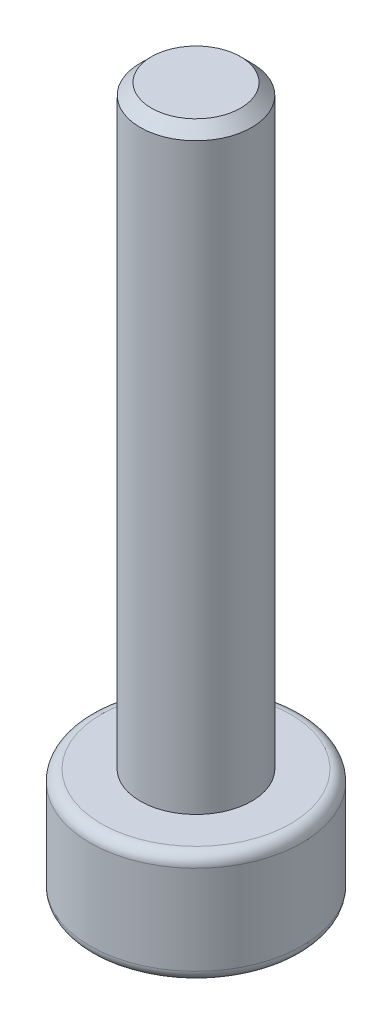
ISO-10303-21;
HEADER;
FILE_DESCRIPTION(('STEP AP214'),'2;1');
FILE_NAME('part.step','',(''),(''),'','','');
FILE_SCHEMA(('AUTOMOTIVE_DESIGN { 1 0 10303 214 1 1 1 1 }'));
ENDSEC;
DATA;
#1=APPLICATION_CONTEXT('core data for automotive mechanical design processes');
#2=APPLICATION_PROTOCOL_DEFINITION('international standard','automotive_design',2000,#1);
#3=PRODUCT_CONTEXT('',#1,'mechanical');
#4=PRODUCT('Part','Part','',(#3));
#5=PRODUCT_RELATED_PRODUCT_CATEGORY('part','',(#4));
#6=PRODUCT_DEFINITION_FORMATION('','',#4);
#7=PRODUCT_DEFINITION_CONTEXT('part definition',#1,'design');
#8=PRODUCT_DEFINITION('design','',#6,#7);
#9=PRODUCT_DEFINITION_SHAPE('','',#8);
#10=(LENGTH_UNIT() NAMED_UNIT(*) SI_UNIT(.MILLI.,.METRE.));
#11=(NAMED_UNIT(*) PLANE_ANGLE_UNIT() SI_UNIT($,.RADIAN.));
#12=(NAMED_UNIT(*) SI_UNIT($,.STERADIAN.) SOLID_ANGLE_UNIT());
#13=UNCERTAINTY_MEASURE_WITH_UNIT(LENGTH_MEASURE(1.E-05),#10,'distance_accuracy_value','');
#14=(GEOMETRIC_REPRESENTATION_CONTEXT(3) GLOBAL_UNCERTAINTY_ASSIGNED_CONTEXT((#13)) GLOBAL_UNIT_ASSIGNED_CONTEXT((#10,
#11,#12)) REPRESENTATION_CONTEXT('',''));
#15=CARTESIAN_POINT('',(0.,0.,0.));
#16=DIRECTION('',(0.,0.,1.));
#17=DIRECTION('',(1.,0.,0.));
#18=AXIS2_PLACEMENT_3D('',#15,#16,#17);
#19=CARTESIAN_POINT('',(0.,3.,0.));
#20=DIRECTION('',(0.,-1.,0.));
#21=DIRECTION('',(0.,0.,-1.));
#22=AXIS2_PLACEMENT_3D('',#19,#20,#21);
#23=CYLINDRICAL_SURFACE('',#22,2.85);
#24=CARTESIAN_POINT('',(0.,2.7,0.));
#25=DIRECTION('',(0.,1.,0.));
#26=DIRECTION('',(0.,0.,1.));
#27=AXIS2_PLACEMENT_3D('',#24,#25,#26);
#28=CIRCLE('',#27,2.85);
#29=CARTESIAN_POINT('',(0.,2.7,2.85));
#30=VERTEX_POINT('',#29);
#31=EDGE_CURVE('E68',#30,#30,#28,.F.);
#32=ORIENTED_EDGE('',*,*,#31,.T.);
#33=EDGE_LOOP('',(#32));
#34=FACE_BOUND('',#33,.T.);
#35=CARTESIAN_POINT('',(0.,0.3,0.));
#36=DIRECTION('',(0.,1.,0.));
#37=DIRECTION('',(0.,0.,1.));
#38=AXIS2_PLACEMENT_3D('',#35,#36,#37);
#39=CIRCLE('',#38,2.85);
#40=CARTESIAN_POINT('',(0.,0.3,2.85));
#41=VERTEX_POINT('',#40);
#42=EDGE_CURVE('E72',#41,#41,#39,.T.);
#43=ORIENTED_EDGE('',*,*,#42,.T.);
#44=EDGE_LOOP('',(#43));
#45=FACE_BOUND('',#44,.T.);
#46=ADVANCED_FACE('F39',(#34,#45),#23,.T.);
#47=CARTESIAN_POINT('',(0.,3.,0.));
#48=DIRECTION('',(0.,1.,0.));
#49=DIRECTION('',(0.,0.,1.));
#50=AXIS2_PLACEMENT_3D('',#47,#48,#49);
#51=PLANE('',#50);
#52=CARTESIAN_POINT('',(0.,3.,0.));
#53=DIRECTION('',(0.,1.,0.));
#54=DIRECTION('',(0.,0.,1.));
#55=AXIS2_PLACEMENT_3D('',#52,#53,#54);
#56=CIRCLE('',#55,2.55);
#57=CARTESIAN_POINT('',(0.,3.,2.55));
#58=VERTEX_POINT('',#57);
#59=EDGE_CURVE('E76',#58,#58,#56,.T.);
#60=ORIENTED_EDGE('',*,*,#59,.T.);
#61=EDGE_LOOP('',(#60));
#62=FACE_BOUND('',#61,.T.);
#63=CARTESIAN_POINT('',(0.,3.,0.));
#64=DIRECTION('',(0.,1.,0.));
#65=DIRECTION('',(0.,0.,1.));
#66=AXIS2_PLACEMENT_3D('',#63,#64,#65);
#67=CIRCLE('',#66,1.5);
#68=CARTESIAN_POINT('',(0.,3.,1.5));
#69=VERTEX_POINT('',#68);
#70=EDGE_CURVE('E80',#69,#69,#67,.T.);
#71=ORIENTED_EDGE('',*,*,#70,.F.);
#72=EDGE_LOOP('',(#71));
#73=FACE_BOUND('',#72,.T.);
#74=ADVANCED_FACE('F105',(#62,#73),#51,.T.);
#75=CARTESIAN_POINT('',(0.,0.,0.));
#76=DIRECTION('',(0.,1.,0.));
#77=DIRECTION('',(0.,0.,1.));
#78=AXIS2_PLACEMENT_3D('',#75,#76,#77);
#79=PLANE('',#78);
#80=CARTESIAN_POINT('',(0.,0.,0.));
#81=DIRECTION('',(0.,1.,0.));
#82=DIRECTION('',(0.,0.,1.));
#83=AXIS2_PLACEMENT_3D('',#80,#81,#82);
#84=CIRCLE('',#83,1.44);
#85=CARTESIAN_POINT('',(0.,0.,1.44));
#86=VERTEX_POINT('',#85);
#87=EDGE_CURVE('E10',#86,#86,#84,.T.);
#88=ORIENTED_EDGE('',*,*,#87,.T.);
#89=EDGE_LOOP('',(#88));
#90=FACE_BOUND('',#89,.T.);
#91=CARTESIAN_POINT('',(0.,0.,0.));
#92=DIRECTION('',(0.,1.,0.));
#93=DIRECTION('',(0.,0.,1.));
#94=AXIS2_PLACEMENT_3D('',#91,#92,#93);
#95=CIRCLE('',#94,2.55);
#96=CARTESIAN_POINT('',(0.,0.,2.55));
#97=VERTEX_POINT('',#96);
#98=EDGE_CURVE('E64',#97,#97,#95,.F.);
#99=ORIENTED_EDGE('',*,*,#98,.T.);
#100=EDGE_LOOP('',(#99));
#101=FACE_BOUND('',#100,.T.);
#102=ADVANCED_FACE('F111',(#90,#101),#79,.F.);
#103=CARTESIAN_POINT('',(0.,19.,0.));
#104=DIRECTION('',(0.,-1.,0.));
#105=DIRECTION('',(0.,0.,-1.));
#106=AXIS2_PLACEMENT_3D('',#103,#104,#105);
#107=CYLINDRICAL_SURFACE('',#106,1.5);
#108=CARTESIAN_POINT('',(0.,18.7,0.));
#109=DIRECTION('',(0.,1.,0.));
#110=DIRECTION('',(0.,0.,1.));
#111=AXIS2_PLACEMENT_3D('',#108,#109,#110);
#112=CIRCLE('',#111,1.5);
#113=CARTESIAN_POINT('',(0.,18.7,1.5));
#114=VERTEX_POINT('',#113);
#115=EDGE_CURVE('E53',#114,#114,#112,.F.);
#116=ORIENTED_EDGE('',*,*,#115,.T.);
#117=EDGE_LOOP('',(#116));
#118=FACE_BOUND('',#117,.T.);
#119=ORIENTED_EDGE('',*,*,#70,.T.);
#120=EDGE_LOOP('',(#119));
#121=FACE_BOUND('',#120,.T.);
#122=ADVANCED_FACE('F101',(#118,#121),#107,.T.);
#123=CARTESIAN_POINT('',(0.,19.,0.));
#124=DIRECTION('',(0.,1.,0.));
#125=DIRECTION('',(0.,0.,1.));
#126=AXIS2_PLACEMENT_3D('',#123,#124,#125);
#127=PLANE('',#126);
#128=CARTESIAN_POINT('',(0.,19.,0.));
#129=DIRECTION('',(0.,1.,0.));
#130=DIRECTION('',(0.,0.,1.));
#131=AXIS2_PLACEMENT_3D('',#128,#129,#130);
#132=CIRCLE('',#131,1.2);
#133=CARTESIAN_POINT('',(0.,19.,1.2));
#134=VERTEX_POINT('',#133);
#135=EDGE_CURVE('E58',#134,#134,#132,.T.);
#136=ORIENTED_EDGE('',*,*,#135,.T.);
#137=EDGE_LOOP('',(#136));
#138=FACE_BOUND('',#137,.T.);
#139=ADVANCED_FACE('F93',(#138),#127,.T.);
#140=CARTESIAN_POINT('',(0.,1.3,0.));
#141=DIRECTION('',(0.,-1.,0.));
#142=DIRECTION('',(0.,0.,-1.));
#143=AXIS2_PLACEMENT_3D('',#140,#141,#142);
#144=CYLINDRICAL_SURFACE('',#143,1.29);
#145=CARTESIAN_POINT('',(0.,0.15,0.));
#146=DIRECTION('',(0.,1.,0.));
#147=DIRECTION('',(0.,0.,1.));
#148=AXIS2_PLACEMENT_3D('',#145,#146,#147);
#149=CIRCLE('',#148,1.29);
#150=CARTESIAN_POINT('',(0.,0.15,1.29));
#151=VERTEX_POINT('',#150);
#152=EDGE_CURVE('E48',#151,#151,#149,.F.);
#153=ORIENTED_EDGE('',*,*,#152,.T.);
#154=EDGE_LOOP('',(#153));
#155=FACE_BOUND('',#154,.T.);
#156=CARTESIAN_POINT('',(0.,1.3,0.));
#157=DIRECTION('',(0.,-1.,0.));
#158=DIRECTION('',(0.,0.,-1.));
#159=AXIS2_PLACEMENT_3D('',#156,#157,#158);
#160=CIRCLE('',#159,1.29);
#161=CARTESIAN_POINT('',(0.,1.3,-1.29));
#162=VERTEX_POINT('',#161);
#163=EDGE_CURVE('E84',#162,#162,#160,.T.);
#164=ORIENTED_EDGE('',*,*,#163,.F.);
#165=EDGE_LOOP('',(#164));
#166=FACE_BOUND('',#165,.T.);
#167=ADVANCED_FACE('F91',(#155,#166),#144,.F.);
#168=CARTESIAN_POINT('',(0.,1.3,0.));
#169=DIRECTION('',(0.,-1.,0.));
#170=DIRECTION('',(0.,0.,-1.));
#171=AXIS2_PLACEMENT_3D('',#168,#169,#170);
#172=PLANE('',#171);
#173=ORIENTED_EDGE('',*,*,#163,.T.);
#174=EDGE_LOOP('',(#173));
#175=FACE_BOUND('',#174,.T.);
#176=ADVANCED_FACE('F89',(#175),#172,.T.);
#177=CARTESIAN_POINT('',(0.,2.7,0.));
#178=DIRECTION('',(0.,1.,0.));
#179=DIRECTION('',(0.,0.,1.));
#180=AXIS2_PLACEMENT_3D('',#177,#178,#179);
#181=TOROIDAL_SURFACE('',#180,2.55,0.3);
#182=ORIENTED_EDGE('',*,*,#31,.F.);
#183=EDGE_LOOP('',(#182));
#184=FACE_BOUND('',#183,.T.);
#185=ORIENTED_EDGE('',*,*,#59,.F.);
#186=EDGE_LOOP('',(#185));
#187=FACE_BOUND('',#186,.T.);
#188=ADVANCED_FACE('F99',(#184,#187),#181,.T.);
#189=CARTESIAN_POINT('',(0.,0.3,0.));
#190=DIRECTION('',(0.,1.,0.));
#191=DIRECTION('',(0.,0.,1.));
#192=AXIS2_PLACEMENT_3D('',#189,#190,#191);
#193=TOROIDAL_SURFACE('',#192,2.55,0.3);
#194=ORIENTED_EDGE('',*,*,#98,.F.);
#195=EDGE_LOOP('',(#194));
#196=FACE_BOUND('',#195,.T.);
#197=ORIENTED_EDGE('',*,*,#42,.F.);
#198=EDGE_LOOP('',(#197));
#199=FACE_BOUND('',#198,.T.);
#200=ADVANCED_FACE('F119',(#196,#199),#193,.T.);
#201=CARTESIAN_POINT('',(0.,19.,0.));
#202=DIRECTION('',(0.,-1.,0.));
#203=DIRECTION('',(0.,0.,-1.));
#204=AXIS2_PLACEMENT_3D('',#201,#202,#203);
#205=CONICAL_SURFACE('',#204,1.2,0.785398163397449);
#206=ORIENTED_EDGE('',*,*,#115,.F.);
#207=EDGE_LOOP('',(#206));
#208=FACE_BOUND('',#207,.T.);
#209=ORIENTED_EDGE('',*,*,#135,.F.);
#210=EDGE_LOOP('',(#209));
#211=FACE_BOUND('',#210,.T.);
#212=ADVANCED_FACE('F122',(#208,#211),#205,.T.);
#213=CARTESIAN_POINT('',(0.,0.15,0.));
#214=DIRECTION('',(0.,-1.,0.));
#215=DIRECTION('',(0.,0.,-1.));
#216=AXIS2_PLACEMENT_3D('',#213,#214,#215);
#217=CONICAL_SURFACE('',#216,1.29,0.78539816339745);
#218=ORIENTED_EDGE('',*,*,#87,.F.);
#219=EDGE_LOOP('',(#218));
#220=FACE_BOUND('',#219,.T.);
#221=ORIENTED_EDGE('',*,*,#152,.F.);
#222=EDGE_LOOP('',(#221));
#223=FACE_BOUND('',#222,.T.);
#224=ADVANCED_FACE('F42',(#220,#223),#217,.F.);
#225=CLOSED_SHELL('',(#46,#74,#102,#122,#139,#167,#176,#188,#200,#212,#224));
#226=MANIFOLD_SOLID_BREP('B2',#225);
#227=ADVANCED_BREP_SHAPE_REPRESENTATION('',(#18,#226),#14);
#228=SHAPE_DEFINITION_REPRESENTATION(#9,#227);
ENDSEC;
END-ISO-10303-21;
